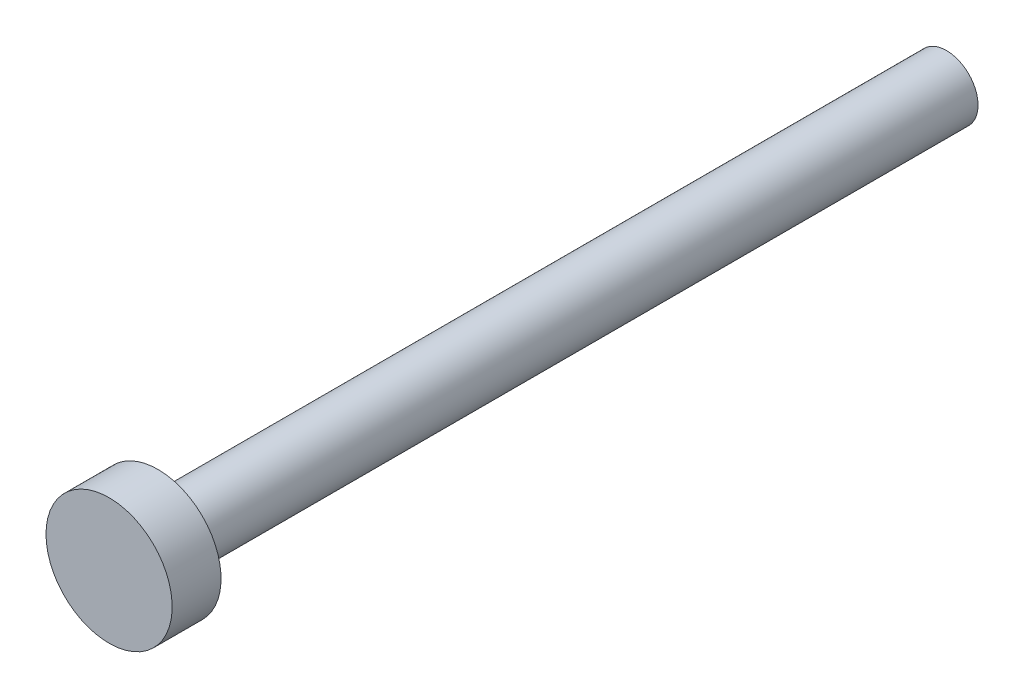
ISO-10303-21;
HEADER;
FILE_DESCRIPTION(('STEP AP214'),'2;1');
FILE_NAME('part.step','',(''),(''),'','','');
FILE_SCHEMA(('AUTOMOTIVE_DESIGN { 1 0 10303 214 1 1 1 1 }'));
ENDSEC;
DATA;
#1=APPLICATION_CONTEXT('core data for automotive mechanical design processes');
#2=APPLICATION_PROTOCOL_DEFINITION('international standard','automotive_design',2000,#1);
#3=PRODUCT_CONTEXT('',#1,'mechanical');
#4=PRODUCT('Part','Part','',(#3));
#5=PRODUCT_RELATED_PRODUCT_CATEGORY('part','',(#4));
#6=PRODUCT_DEFINITION_FORMATION('','',#4);
#7=PRODUCT_DEFINITION_CONTEXT('part definition',#1,'design');
#8=PRODUCT_DEFINITION('design','',#6,#7);
#9=PRODUCT_DEFINITION_SHAPE('','',#8);
#10=(LENGTH_UNIT() NAMED_UNIT(*) SI_UNIT(.MILLI.,.METRE.));
#11=(NAMED_UNIT(*) PLANE_ANGLE_UNIT() SI_UNIT($,.RADIAN.));
#12=(NAMED_UNIT(*) SI_UNIT($,.STERADIAN.) SOLID_ANGLE_UNIT());
#13=UNCERTAINTY_MEASURE_WITH_UNIT(LENGTH_MEASURE(1.E-05),#10,'distance_accuracy_value','');
#14=(GEOMETRIC_REPRESENTATION_CONTEXT(3) GLOBAL_UNCERTAINTY_ASSIGNED_CONTEXT((#13)) GLOBAL_UNIT_ASSIGNED_CONTEXT((#10,
#11,#12)) REPRESENTATION_CONTEXT('',''));
#15=CARTESIAN_POINT('',(0.,0.,0.));
#16=DIRECTION('',(0.,0.,1.));
#17=DIRECTION('',(1.,0.,0.));
#18=AXIS2_PLACEMENT_3D('',#15,#16,#17);
#19=CARTESIAN_POINT('',(0.,0.,3.1));
#20=DIRECTION('',(0.,0.,-1.));
#21=DIRECTION('',(-1.,0.,0.));
#22=AXIS2_PLACEMENT_3D('',#19,#20,#21);
#23=CYLINDRICAL_SURFACE('',#22,4.);
#24=CARTESIAN_POINT('',(0.,0.,3.1));
#25=DIRECTION('',(0.,0.,1.));
#26=DIRECTION('',(1.,0.,0.));
#27=AXIS2_PLACEMENT_3D('',#24,#25,#26);
#28=CIRCLE('',#27,4.);
#29=CARTESIAN_POINT('',(-4.,0.,3.1));
#30=VERTEX_POINT('',#29);
#31=EDGE_CURVE('E37',#30,#30,#28,.T.);
#32=CARTESIAN_POINT('',(0.,0.,0.));
#33=DIRECTION('',(0.,0.,1.));
#34=DIRECTION('',(1.,0.,0.));
#35=AXIS2_PLACEMENT_3D('',#32,#33,#34);
#36=CIRCLE('',#35,4.);
#37=CARTESIAN_POINT('',(-4.,0.,0.));
#38=VERTEX_POINT('',#37);
#39=EDGE_CURVE('E33',#38,#38,#36,.T.);
#40=CARTESIAN_POINT('',(-4.,0.,3.1));
#41=CARTESIAN_POINT('',(-4.,0.,3.06770833333333));
#42=CARTESIAN_POINT('',(-4.,0.,3.03541666666667));
#43=CARTESIAN_POINT('',(-4.,0.,2.97083333333333));
#44=CARTESIAN_POINT('',(-4.,0.,2.93854166666667));
#45=CARTESIAN_POINT('',(-4.,0.,2.87395833333333));
#46=CARTESIAN_POINT('',(-4.,0.,2.84166666666667));
#47=CARTESIAN_POINT('',(-4.,0.,2.77708333333333));
#48=CARTESIAN_POINT('',(-4.,0.,2.74479166666667));
#49=CARTESIAN_POINT('',(-4.,0.,2.68020833333333));
#50=CARTESIAN_POINT('',(-4.,0.,2.64791666666667));
#51=CARTESIAN_POINT('',(-4.,0.,2.58333333333333));
#52=CARTESIAN_POINT('',(-4.,0.,2.55104166666667));
#53=CARTESIAN_POINT('',(-4.,0.,2.48645833333333));
#54=CARTESIAN_POINT('',(-4.,0.,2.45416666666667));
#55=CARTESIAN_POINT('',(-4.,0.,2.38958333333333));
#56=CARTESIAN_POINT('',(-4.,0.,2.35729166666667));
#57=CARTESIAN_POINT('',(-4.,0.,2.29270833333333));
#58=CARTESIAN_POINT('',(-4.,0.,2.26041666666667));
#59=CARTESIAN_POINT('',(-4.,0.,2.19583333333333));
#60=CARTESIAN_POINT('',(-4.,0.,2.16354166666667));
#61=CARTESIAN_POINT('',(-4.,0.,2.09895833333333));
#62=CARTESIAN_POINT('',(-4.,0.,2.06666666666667));
#63=CARTESIAN_POINT('',(-4.,0.,2.00208333333333));
#64=CARTESIAN_POINT('',(-4.,0.,1.96979166666667));
#65=CARTESIAN_POINT('',(-4.,0.,1.90520833333333));
#66=CARTESIAN_POINT('',(-4.,0.,1.87291666666667));
#67=CARTESIAN_POINT('',(-4.,0.,1.80833333333333));
#68=CARTESIAN_POINT('',(-4.,0.,1.77604166666667));
#69=CARTESIAN_POINT('',(-4.,0.,1.71145833333333));
#70=CARTESIAN_POINT('',(-4.,0.,1.67916666666667));
#71=CARTESIAN_POINT('',(-4.,0.,1.61458333333333));
#72=CARTESIAN_POINT('',(-4.,0.,1.58229166666667));
#73=CARTESIAN_POINT('',(-4.,0.,1.51770833333333));
#74=CARTESIAN_POINT('',(-4.,0.,1.48541666666667));
#75=CARTESIAN_POINT('',(-4.,0.,1.42083333333333));
#76=CARTESIAN_POINT('',(-4.,0.,1.38854166666667));
#77=CARTESIAN_POINT('',(-4.,0.,1.32395833333333));
#78=CARTESIAN_POINT('',(-4.,0.,1.29166666666667));
#79=CARTESIAN_POINT('',(-4.,0.,1.22708333333333));
#80=CARTESIAN_POINT('',(-4.,0.,1.19479166666667));
#81=CARTESIAN_POINT('',(-4.,0.,1.13020833333333));
#82=CARTESIAN_POINT('',(-4.,0.,1.09791666666667));
#83=CARTESIAN_POINT('',(-4.,0.,1.03333333333333));
#84=CARTESIAN_POINT('',(-4.,0.,1.00104166666667));
#85=CARTESIAN_POINT('',(-4.,0.,0.936458333333333));
#86=CARTESIAN_POINT('',(-4.,0.,0.904166666666667));
#87=CARTESIAN_POINT('',(-4.,0.,0.839583333333333));
#88=CARTESIAN_POINT('',(-4.,0.,0.807291666666667));
#89=CARTESIAN_POINT('',(-4.,0.,0.742708333333333));
#90=CARTESIAN_POINT('',(-4.,0.,0.710416666666667));
#91=CARTESIAN_POINT('',(-4.,0.,0.645833333333333));
#92=CARTESIAN_POINT('',(-4.,0.,0.613541666666667));
#93=CARTESIAN_POINT('',(-4.,0.,0.548958333333333));
#94=CARTESIAN_POINT('',(-4.,0.,0.516666666666667));
#95=CARTESIAN_POINT('',(-4.,0.,0.452083333333333));
#96=CARTESIAN_POINT('',(-4.,0.,0.419791666666667));
#97=CARTESIAN_POINT('',(-4.,0.,0.355208333333333));
#98=CARTESIAN_POINT('',(-4.,0.,0.322916666666667));
#99=CARTESIAN_POINT('',(-4.,0.,0.258333333333333));
#100=CARTESIAN_POINT('',(-4.,0.,0.226041666666667));
#101=CARTESIAN_POINT('',(-4.,0.,0.161458333333333));
#102=CARTESIAN_POINT('',(-4.,0.,0.129166666666667));
#103=CARTESIAN_POINT('',(-4.,0.,0.0645833333333335));
#104=CARTESIAN_POINT('',(-4.,0.,0.0322916666666667));
#105=CARTESIAN_POINT('',(-4.,0.,0.));
#106=B_SPLINE_CURVE_WITH_KNOTS('',3,(#40,#41,#42,#43,#44,#45,#46,#47,#48,#49,#50,#51,#52,#53,
#54,#55,#56,#57,#58,#59,#60,#61,#62,#63,#64,#65,#66,#67,#68,#69,#70,#71,#72,#73,#74,#75,#76,#77,
#78,#79,#80,#81,#82,#83,#84,#85,#86,#87,#88,#89,#90,#91,#92,#93,#94,#95,#96,#97,#98,#99,#100,
#101,#102,#103,#104,#105),.UNSPECIFIED.,.F.,.F.,(4,2,2,2,2,2,2,2,2,2,2,2,2,2,2,2,2,2,2,2,2,2,2,
2,2,2,2,2,2,2,2,2,4),(0.,0.0968749999999997,0.19375,0.290625,0.3875,0.484375,0.58125,0.678125,
0.775,0.871874999999999,0.96875,1.065625,1.1625,1.259375,1.35625,1.453125,1.55,1.646875,1.74375,
1.840625,1.9375,2.034375,2.13125,2.228125,2.325,2.421875,2.51875,2.615625,2.7125,2.809375,
2.90625,3.003125,3.1),.UNSPECIFIED.);
#107=EDGE_CURVE('BSEAM30',#30,#38,#106,.T.);
#108=ORIENTED_EDGE('',*,*,#31,.F.);
#109=ORIENTED_EDGE('',*,*,#39,.T.);
#110=ORIENTED_EDGE('',*,*,#107,.T.);
#111=ORIENTED_EDGE('',*,*,#107,.F.);
#112=EDGE_LOOP('',(#108,#110,#109,#111));
#113=FACE_BOUND('',#112,.T.);
#114=ADVANCED_FACE('F30',(#113),#23,.T.);
#115=CARTESIAN_POINT('',(0.,0.,3.1));
#116=DIRECTION('',(0.,0.,1.));
#117=DIRECTION('',(1.,0.,0.));
#118=AXIS2_PLACEMENT_3D('',#115,#116,#117);
#119=PLANE('',#118);
#120=ORIENTED_EDGE('',*,*,#31,.T.);
#121=EDGE_LOOP('',(#120));
#122=FACE_BOUND('',#121,.T.);
#123=ADVANCED_FACE('F54',(#122),#119,.T.);
#124=CARTESIAN_POINT('',(0.,0.,0.));
#125=DIRECTION('',(0.,0.,1.));
#126=DIRECTION('',(1.,0.,0.));
#127=AXIS2_PLACEMENT_3D('',#124,#125,#126);
#128=PLANE('',#127);
#129=CARTESIAN_POINT('',(0.,0.,0.));
#130=DIRECTION('',(0.,0.,-1.));
#131=DIRECTION('',(-1.,0.,0.));
#132=AXIS2_PLACEMENT_3D('',#129,#130,#131);
#133=CIRCLE('',#132,2.);
#134=CARTESIAN_POINT('',(-2.,0.,0.));
#135=VERTEX_POINT('',#134);
#136=EDGE_CURVE('E10',#135,#135,#133,.T.);
#137=ORIENTED_EDGE('',*,*,#136,.F.);
#138=EDGE_LOOP('',(#137));
#139=FACE_BOUND('',#138,.T.);
#140=ORIENTED_EDGE('',*,*,#39,.F.);
#141=EDGE_LOOP('',(#140));
#142=FACE_BOUND('',#141,.T.);
#143=ADVANCED_FACE('F51',(#139,#142),#128,.F.);
#144=CARTESIAN_POINT('',(0.,0.,-50.));
#145=DIRECTION('',(0.,0.,1.));
#146=DIRECTION('',(1.,0.,0.));
#147=AXIS2_PLACEMENT_3D('',#144,#145,#146);
#148=CYLINDRICAL_SURFACE('',#147,2.);
#149=CARTESIAN_POINT('',(0.,0.,-50.));
#150=DIRECTION('',(0.,0.,-1.));
#151=DIRECTION('',(-1.,0.,0.));
#152=AXIS2_PLACEMENT_3D('',#149,#150,#151);
#153=CIRCLE('',#152,2.);
#154=CARTESIAN_POINT('',(-2.,0.,-50.));
#155=VERTEX_POINT('',#154);
#156=EDGE_CURVE('E43',#155,#155,#153,.T.);
#157=ORIENTED_EDGE('',*,*,#156,.F.);
#158=EDGE_LOOP('',(#157));
#159=FACE_BOUND('',#158,.T.);
#160=ORIENTED_EDGE('',*,*,#136,.T.);
#161=EDGE_LOOP('',(#160));
#162=FACE_BOUND('',#161,.T.);
#163=ADVANCED_FACE('F53',(#159,#162),#148,.T.);
#164=CARTESIAN_POINT('',(0.,0.,-50.));
#165=DIRECTION('',(0.,0.,-1.));
#166=DIRECTION('',(-1.,0.,0.));
#167=AXIS2_PLACEMENT_3D('',#164,#165,#166);
#168=PLANE('',#167);
#169=ORIENTED_EDGE('',*,*,#156,.T.);
#170=EDGE_LOOP('',(#169));
#171=FACE_BOUND('',#170,.T.);
#172=ADVANCED_FACE('F60',(#171),#168,.T.);
#173=CLOSED_SHELL('',(#114,#123,#143,#163,#172));
#174=MANIFOLD_SOLID_BREP('B2',#173);
#175=ADVANCED_BREP_SHAPE_REPRESENTATION('',(#18,#174),#14);
#176=SHAPE_DEFINITION_REPRESENTATION(#9,#175);
ENDSEC;
END-ISO-10303-21;
